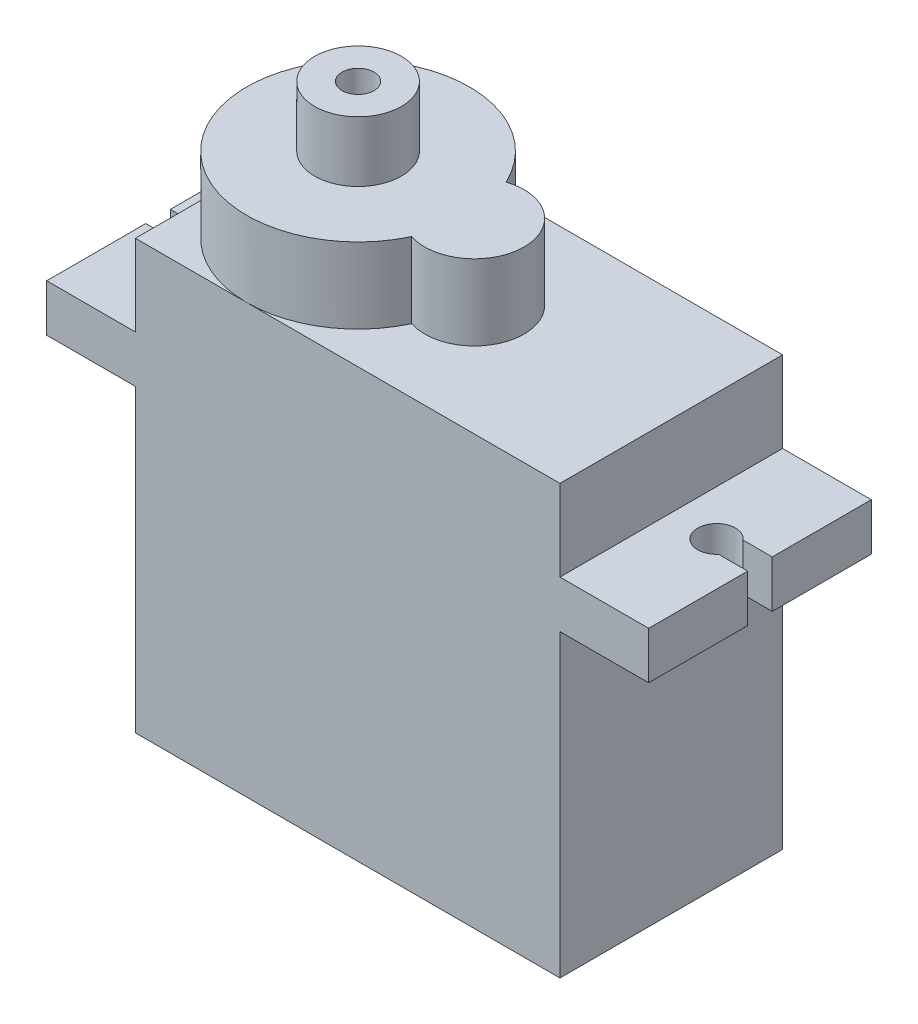
ISO-10303-21;
HEADER;
FILE_DESCRIPTION(('STEP AP214'),'2;1');
FILE_NAME('part.step','',(''),(''),'','','');
FILE_SCHEMA(('AUTOMOTIVE_DESIGN { 1 0 10303 214 1 1 1 1 }'));
ENDSEC;
DATA;
#1=APPLICATION_CONTEXT('core data for automotive mechanical design processes');
#2=APPLICATION_PROTOCOL_DEFINITION('international standard','automotive_design',2000,#1);
#3=PRODUCT_CONTEXT('',#1,'mechanical');
#4=PRODUCT('Part','Part','',(#3));
#5=PRODUCT_RELATED_PRODUCT_CATEGORY('part','',(#4));
#6=PRODUCT_DEFINITION_FORMATION('','',#4);
#7=PRODUCT_DEFINITION_CONTEXT('part definition',#1,'design');
#8=PRODUCT_DEFINITION('design','',#6,#7);
#9=PRODUCT_DEFINITION_SHAPE('','',#8);
#10=(LENGTH_UNIT() NAMED_UNIT(*) SI_UNIT(.MILLI.,.METRE.));
#11=(NAMED_UNIT(*) PLANE_ANGLE_UNIT() SI_UNIT($,.RADIAN.));
#12=(NAMED_UNIT(*) SI_UNIT($,.STERADIAN.) SOLID_ANGLE_UNIT());
#13=UNCERTAINTY_MEASURE_WITH_UNIT(LENGTH_MEASURE(1.E-05),#10,'distance_accuracy_value','');
#14=(GEOMETRIC_REPRESENTATION_CONTEXT(3) GLOBAL_UNCERTAINTY_ASSIGNED_CONTEXT((#13)) GLOBAL_UNIT_ASSIGNED_CONTEXT((#10,
#11,#12)) REPRESENTATION_CONTEXT('',''));
#15=CARTESIAN_POINT('',(0.,0.,0.));
#16=DIRECTION('',(0.,0.,1.));
#17=DIRECTION('',(1.,0.,0.));
#18=AXIS2_PLACEMENT_3D('',#15,#16,#17);
#19=CARTESIAN_POINT('',(27.2,15.9,-5.9));
#20=DIRECTION('',(0.,1.,0.));
#21=DIRECTION('',(0.,0.,1.));
#22=AXIS2_PLACEMENT_3D('',#19,#20,#21);
#23=PLANE('',#22);
#24=DIRECTION('',(1.,0.,0.));
#25=VECTOR('',#24,1.);
#26=CARTESIAN_POINT('',(27.2,15.9,-6.55));
#27=LINE('',#26,#25);
#28=CARTESIAN_POINT('',(25.6599342076785,15.9,-6.55));
#29=VERTEX_POINT('',#28);
#30=CARTESIAN_POINT('',(27.2,15.9,-6.55));
#31=VERTEX_POINT('',#30);
#32=EDGE_CURVE('E202',#29,#31,#27,.T.);
#33=ORIENTED_EDGE('',*,*,#32,.F.);
#34=CARTESIAN_POINT('',(24.9,15.9,-5.9));
#35=DIRECTION('',(0.,1.,0.));
#36=DIRECTION('',(0.,0.,1.));
#37=AXIS2_PLACEMENT_3D('',#34,#35,#36);
#38=CIRCLE('',#37,1.);
#39=CARTESIAN_POINT('',(25.6599342076785,15.9,-5.25));
#40=VERTEX_POINT('',#39);
#41=EDGE_CURVE('E401',#40,#29,#38,.F.);
#42=ORIENTED_EDGE('',*,*,#41,.F.);
#43=DIRECTION('',(-1.,0.,0.));
#44=VECTOR('',#43,1.);
#45=CARTESIAN_POINT('',(27.2,15.9,-5.25));
#46=LINE('',#45,#44);
#47=CARTESIAN_POINT('',(27.2,15.9,-5.25));
#48=VERTEX_POINT('',#47);
#49=EDGE_CURVE('E206',#48,#40,#46,.T.);
#50=ORIENTED_EDGE('',*,*,#49,.F.);
#51=DIRECTION('',(0.,0.,-1.));
#52=VECTOR('',#51,1.);
#53=CARTESIAN_POINT('',(27.2,15.9,0.));
#54=LINE('',#53,#52);
#55=CARTESIAN_POINT('',(27.2,15.9,0.));
#56=VERTEX_POINT('',#55);
#57=EDGE_CURVE('E350',#56,#48,#54,.T.);
#58=ORIENTED_EDGE('',*,*,#57,.F.);
#59=DIRECTION('',(-1.,0.,0.));
#60=VECTOR('',#59,1.);
#61=CARTESIAN_POINT('',(27.2,15.9,0.));
#62=LINE('',#61,#60);
#63=CARTESIAN_POINT('',(22.5,15.9,0.));
#64=VERTEX_POINT('',#63);
#65=EDGE_CURVE('E224',#56,#64,#62,.T.);
#66=ORIENTED_EDGE('',*,*,#65,.T.);
#67=DIRECTION('',(0.,0.,-1.));
#68=VECTOR('',#67,1.);
#69=CARTESIAN_POINT('',(22.5,15.9,-5.9));
#70=LINE('',#69,#68);
#71=CARTESIAN_POINT('',(22.5,15.9,-11.8));
#72=VERTEX_POINT('',#71);
#73=EDGE_CURVE('E229',#64,#72,#70,.T.);
#74=ORIENTED_EDGE('',*,*,#73,.T.);
#75=DIRECTION('',(-1.,0.,0.));
#76=VECTOR('',#75,1.);
#77=CARTESIAN_POINT('',(27.2,15.9,-11.8));
#78=LINE('',#77,#76);
#79=CARTESIAN_POINT('',(27.2,15.9,-11.8));
#80=VERTEX_POINT('',#79);
#81=EDGE_CURVE('E244',#80,#72,#78,.T.);
#82=ORIENTED_EDGE('',*,*,#81,.F.);
#83=EDGE_CURVE('E236',#31,#80,#54,.T.);
#84=ORIENTED_EDGE('',*,*,#83,.F.);
#85=EDGE_LOOP('',(#33,#42,#50,#58,#66,#74,#82,#84));
#86=FACE_BOUND('',#85,.T.);
#87=ADVANCED_FACE('F36',(#86),#23,.F.);
#88=CARTESIAN_POINT('',(27.2,18.4,-11.8));
#89=DIRECTION('',(0.,-1.,0.));
#90=DIRECTION('',(0.,0.,-1.));
#91=AXIS2_PLACEMENT_3D('',#88,#89,#90);
#92=PLANE('',#91);
#93=DIRECTION('',(1.,0.,0.));
#94=VECTOR('',#93,1.);
#95=CARTESIAN_POINT('',(27.2,18.4,-6.55));
#96=LINE('',#95,#94);
#97=CARTESIAN_POINT('',(25.6599342076785,18.4,-6.55));
#98=VERTEX_POINT('',#97);
#99=CARTESIAN_POINT('',(27.2,18.4,-6.55));
#100=VERTEX_POINT('',#99);
#101=EDGE_CURVE('E199',#98,#100,#96,.T.);
#102=ORIENTED_EDGE('',*,*,#101,.T.);
#103=DIRECTION('',(0.,0.,1.));
#104=VECTOR('',#103,1.);
#105=CARTESIAN_POINT('',(27.2,18.4,-11.8));
#106=LINE('',#105,#104);
#107=CARTESIAN_POINT('',(27.2,18.4,-11.8));
#108=VERTEX_POINT('',#107);
#109=EDGE_CURVE('E214',#108,#100,#106,.T.);
#110=ORIENTED_EDGE('',*,*,#109,.F.);
#111=DIRECTION('',(-1.,0.,0.));
#112=VECTOR('',#111,1.);
#113=CARTESIAN_POINT('',(27.2,18.4,-11.8));
#114=LINE('',#113,#112);
#115=CARTESIAN_POINT('',(22.5,18.4,-11.8));
#116=VERTEX_POINT('',#115);
#117=EDGE_CURVE('E242',#108,#116,#114,.T.);
#118=ORIENTED_EDGE('',*,*,#117,.T.);
#119=DIRECTION('',(0.,0.,1.));
#120=VECTOR('',#119,1.);
#121=CARTESIAN_POINT('',(22.5,18.4,-11.8));
#122=LINE('',#121,#120);
#123=CARTESIAN_POINT('',(22.5,18.4,0.));
#124=VERTEX_POINT('',#123);
#125=EDGE_CURVE('E232',#116,#124,#122,.T.);
#126=ORIENTED_EDGE('',*,*,#125,.T.);
#127=DIRECTION('',(-1.,0.,0.));
#128=VECTOR('',#127,1.);
#129=CARTESIAN_POINT('',(27.2,18.4,0.));
#130=LINE('',#129,#128);
#131=CARTESIAN_POINT('',(27.2,18.4,0.));
#132=VERTEX_POINT('',#131);
#133=EDGE_CURVE('E239',#132,#124,#130,.T.);
#134=ORIENTED_EDGE('',*,*,#133,.F.);
#135=CARTESIAN_POINT('',(27.2,18.4,-5.25));
#136=VERTEX_POINT('',#135);
#137=EDGE_CURVE('E222',#136,#132,#106,.T.);
#138=ORIENTED_EDGE('',*,*,#137,.F.);
#139=DIRECTION('',(-1.,0.,0.));
#140=VECTOR('',#139,1.);
#141=CARTESIAN_POINT('',(27.2,18.4,-5.25));
#142=LINE('',#141,#140);
#143=CARTESIAN_POINT('',(25.6599342076785,18.4,-5.25));
#144=VERTEX_POINT('',#143);
#145=EDGE_CURVE('E51',#136,#144,#142,.T.);
#146=ORIENTED_EDGE('',*,*,#145,.T.);
#147=CARTESIAN_POINT('',(24.9,18.4,-5.9));
#148=DIRECTION('',(0.,-1.,0.));
#149=DIRECTION('',(0.,0.,-1.));
#150=AXIS2_PLACEMENT_3D('',#147,#148,#149);
#151=CIRCLE('',#150,1.);
#152=EDGE_CURVE('E215',#144,#98,#151,.T.);
#153=ORIENTED_EDGE('',*,*,#152,.T.);
#154=EDGE_LOOP('',(#102,#110,#118,#126,#134,#138,#146,#153));
#155=FACE_BOUND('',#154,.T.);
#156=ADVANCED_FACE('F212',(#155),#92,.F.);
#157=CARTESIAN_POINT('',(27.2,0.,0.));
#158=DIRECTION('',(1.,0.,0.));
#159=DIRECTION('',(0.,0.,-1.));
#160=AXIS2_PLACEMENT_3D('',#157,#158,#159);
#161=PLANE('',#160);
#162=ORIENTED_EDGE('',*,*,#109,.T.);
#163=DIRECTION('',(0.,-1.,0.));
#164=VECTOR('',#163,1.);
#165=CARTESIAN_POINT('',(27.2,78.1330272576249,-6.55));
#166=LINE('',#165,#164);
#167=EDGE_CURVE('E195',#100,#31,#166,.T.);
#168=ORIENTED_EDGE('',*,*,#167,.T.);
#169=ORIENTED_EDGE('',*,*,#83,.T.);
#170=DIRECTION('',(0.,1.,0.));
#171=VECTOR('',#170,1.);
#172=CARTESIAN_POINT('',(27.2,15.9,-11.8));
#173=LINE('',#172,#171);
#174=EDGE_CURVE('E219',#80,#108,#173,.T.);
#175=ORIENTED_EDGE('',*,*,#174,.T.);
#176=EDGE_LOOP('',(#162,#168,#169,#175));
#177=FACE_BOUND('',#176,.T.);
#178=ADVANCED_FACE('F217',(#177),#161,.T.);
#179=ORIENTED_EDGE('',*,*,#57,.T.);
#180=DIRECTION('',(0.,-1.,0.));
#181=VECTOR('',#180,1.);
#182=CARTESIAN_POINT('',(27.2,78.1330272576249,-5.25));
#183=LINE('',#182,#181);
#184=EDGE_CURVE('E409',#136,#48,#183,.T.);
#185=ORIENTED_EDGE('',*,*,#184,.F.);
#186=ORIENTED_EDGE('',*,*,#137,.T.);
#187=DIRECTION('',(0.,-1.,0.));
#188=VECTOR('',#187,1.);
#189=CARTESIAN_POINT('',(27.2,18.4,0.));
#190=LINE('',#189,#188);
#191=EDGE_CURVE('E221',#132,#56,#190,.T.);
#192=ORIENTED_EDGE('',*,*,#191,.T.);
#193=EDGE_LOOP('',(#179,#185,#186,#192));
#194=FACE_BOUND('',#193,.T.);
#195=ADVANCED_FACE('F414',(#194),#161,.T.);
#196=CARTESIAN_POINT('',(-4.7,15.9,-11.8));
#197=DIRECTION('',(0.,1.,0.));
#198=DIRECTION('',(0.,0.,1.));
#199=AXIS2_PLACEMENT_3D('',#196,#197,#198);
#200=PLANE('',#199);
#201=DIRECTION('',(-1.,0.,0.));
#202=VECTOR('',#201,1.);
#203=CARTESIAN_POINT('',(-4.7,15.9,-5.25));
#204=LINE('',#203,#202);
#205=CARTESIAN_POINT('',(-3.15993420767853,15.9,-5.25));
#206=VERTEX_POINT('',#205);
#207=CARTESIAN_POINT('',(-4.7,15.9,-5.25));
#208=VERTEX_POINT('',#207);
#209=EDGE_CURVE('E379',#206,#208,#204,.T.);
#210=ORIENTED_EDGE('',*,*,#209,.F.);
#211=CARTESIAN_POINT('',(-2.4,15.9,-5.9));
#212=DIRECTION('',(0.,1.,0.));
#213=DIRECTION('',(0.,0.,1.));
#214=AXIS2_PLACEMENT_3D('',#211,#212,#213);
#215=CIRCLE('',#214,1.);
#216=CARTESIAN_POINT('',(-3.15993420767853,15.9,-6.55));
#217=VERTEX_POINT('',#216);
#218=EDGE_CURVE('E375',#217,#206,#215,.F.);
#219=ORIENTED_EDGE('',*,*,#218,.F.);
#220=DIRECTION('',(1.,0.,0.));
#221=VECTOR('',#220,1.);
#222=CARTESIAN_POINT('',(-4.7,15.9,-6.55));
#223=LINE('',#222,#221);
#224=CARTESIAN_POINT('',(-4.7,15.9,-6.55));
#225=VERTEX_POINT('',#224);
#226=EDGE_CURVE('E381',#225,#217,#223,.T.);
#227=ORIENTED_EDGE('',*,*,#226,.F.);
#228=DIRECTION('',(0.,0.,1.));
#229=VECTOR('',#228,1.);
#230=CARTESIAN_POINT('',(-4.7,15.9,-11.8));
#231=LINE('',#230,#229);
#232=CARTESIAN_POINT('',(-4.7,15.9,-11.8));
#233=VERTEX_POINT('',#232);
#234=EDGE_CURVE('E253',#233,#225,#231,.T.);
#235=ORIENTED_EDGE('',*,*,#234,.F.);
#236=DIRECTION('',(1.,0.,0.));
#237=VECTOR('',#236,1.);
#238=CARTESIAN_POINT('',(-4.7,15.9,-11.8));
#239=LINE('',#238,#237);
#240=CARTESIAN_POINT('',(0.,15.9,-11.8));
#241=VERTEX_POINT('',#240);
#242=EDGE_CURVE('E275',#233,#241,#239,.T.);
#243=ORIENTED_EDGE('',*,*,#242,.T.);
#244=DIRECTION('',(0.,0.,1.));
#245=VECTOR('',#244,1.);
#246=CARTESIAN_POINT('',(0.,15.9,-11.8));
#247=LINE('',#246,#245);
#248=CARTESIAN_POINT('',(0.,15.9,0.));
#249=VERTEX_POINT('',#248);
#250=EDGE_CURVE('E247',#241,#249,#247,.T.);
#251=ORIENTED_EDGE('',*,*,#250,.T.);
#252=DIRECTION('',(1.,0.,0.));
#253=VECTOR('',#252,1.);
#254=CARTESIAN_POINT('',(-4.7,15.9,0.));
#255=LINE('',#254,#253);
#256=CARTESIAN_POINT('',(-4.7,15.9,0.));
#257=VERTEX_POINT('',#256);
#258=EDGE_CURVE('E272',#257,#249,#255,.T.);
#259=ORIENTED_EDGE('',*,*,#258,.F.);
#260=EDGE_CURVE('E251',#208,#257,#231,.T.);
#261=ORIENTED_EDGE('',*,*,#260,.F.);
#262=EDGE_LOOP('',(#210,#219,#227,#235,#243,#251,#259,#261));
#263=FACE_BOUND('',#262,.T.);
#264=ADVANCED_FACE('F475',(#263),#200,.F.);
#265=CARTESIAN_POINT('',(-4.7,18.4,0.));
#266=DIRECTION('',(0.,-1.,0.));
#267=DIRECTION('',(0.,0.,-1.));
#268=AXIS2_PLACEMENT_3D('',#265,#266,#267);
#269=PLANE('',#268);
#270=DIRECTION('',(-1.,0.,0.));
#271=VECTOR('',#270,1.);
#272=CARTESIAN_POINT('',(-4.7,18.4,-5.25));
#273=LINE('',#272,#271);
#274=CARTESIAN_POINT('',(-3.15993420767853,18.4,-5.25));
#275=VERTEX_POINT('',#274);
#276=CARTESIAN_POINT('',(-4.7,18.4,-5.25));
#277=VERTEX_POINT('',#276);
#278=EDGE_CURVE('E398',#275,#277,#273,.T.);
#279=ORIENTED_EDGE('',*,*,#278,.T.);
#280=DIRECTION('',(0.,0.,-1.));
#281=VECTOR('',#280,1.);
#282=CARTESIAN_POINT('',(-4.7,18.4,0.));
#283=LINE('',#282,#281);
#284=CARTESIAN_POINT('',(-4.7,18.4,0.));
#285=VERTEX_POINT('',#284);
#286=EDGE_CURVE('E259',#285,#277,#283,.T.);
#287=ORIENTED_EDGE('',*,*,#286,.F.);
#288=DIRECTION('',(1.,0.,0.));
#289=VECTOR('',#288,1.);
#290=CARTESIAN_POINT('',(-4.7,18.4,0.));
#291=LINE('',#290,#289);
#292=CARTESIAN_POINT('',(0.,18.4,0.));
#293=VERTEX_POINT('',#292);
#294=EDGE_CURVE('E269',#285,#293,#291,.T.);
#295=ORIENTED_EDGE('',*,*,#294,.T.);
#296=DIRECTION('',(0.,0.,-1.));
#297=VECTOR('',#296,1.);
#298=CARTESIAN_POINT('',(0.,18.4,0.));
#299=LINE('',#298,#297);
#300=CARTESIAN_POINT('',(0.,18.4,-11.8));
#301=VERTEX_POINT('',#300);
#302=EDGE_CURVE('E252',#293,#301,#299,.T.);
#303=ORIENTED_EDGE('',*,*,#302,.T.);
#304=DIRECTION('',(1.,0.,0.));
#305=VECTOR('',#304,1.);
#306=CARTESIAN_POINT('',(-4.7,18.4,-11.8));
#307=LINE('',#306,#305);
#308=CARTESIAN_POINT('',(-4.7,18.4,-11.8));
#309=VERTEX_POINT('',#308);
#310=EDGE_CURVE('E262',#309,#301,#307,.T.);
#311=ORIENTED_EDGE('',*,*,#310,.F.);
#312=CARTESIAN_POINT('',(-4.7,18.4,-6.55));
#313=VERTEX_POINT('',#312);
#314=EDGE_CURVE('E258',#313,#309,#283,.T.);
#315=ORIENTED_EDGE('',*,*,#314,.F.);
#316=DIRECTION('',(1.,0.,0.));
#317=VECTOR('',#316,1.);
#318=CARTESIAN_POINT('',(-4.7,18.4,-6.55));
#319=LINE('',#318,#317);
#320=CARTESIAN_POINT('',(-3.15993420767853,18.4,-6.55));
#321=VERTEX_POINT('',#320);
#322=EDGE_CURVE('E59',#313,#321,#319,.T.);
#323=ORIENTED_EDGE('',*,*,#322,.T.);
#324=CARTESIAN_POINT('',(-2.4,18.4,-5.9));
#325=DIRECTION('',(0.,-1.,0.));
#326=DIRECTION('',(0.,0.,-1.));
#327=AXIS2_PLACEMENT_3D('',#324,#325,#326);
#328=CIRCLE('',#327,1.);
#329=EDGE_CURVE('E395',#321,#275,#328,.T.);
#330=ORIENTED_EDGE('',*,*,#329,.T.);
#331=EDGE_LOOP('',(#279,#287,#295,#303,#311,#315,#323,#330));
#332=FACE_BOUND('',#331,.T.);
#333=ADVANCED_FACE('F472',(#332),#269,.F.);
#334=CARTESIAN_POINT('',(-4.7,0.,0.));
#335=DIRECTION('',(-1.,0.,0.));
#336=DIRECTION('',(0.,0.,1.));
#337=AXIS2_PLACEMENT_3D('',#334,#335,#336);
#338=PLANE('',#337);
#339=ORIENTED_EDGE('',*,*,#286,.T.);
#340=DIRECTION('',(0.,-1.,0.));
#341=VECTOR('',#340,1.);
#342=CARTESIAN_POINT('',(-4.7,80.3830272576249,-5.25));
#343=LINE('',#342,#341);
#344=EDGE_CURVE('E383',#277,#208,#343,.T.);
#345=ORIENTED_EDGE('',*,*,#344,.T.);
#346=ORIENTED_EDGE('',*,*,#260,.T.);
#347=DIRECTION('',(0.,1.,0.));
#348=VECTOR('',#347,1.);
#349=CARTESIAN_POINT('',(-4.7,15.9,0.));
#350=LINE('',#349,#348);
#351=EDGE_CURVE('E256',#257,#285,#350,.T.);
#352=ORIENTED_EDGE('',*,*,#351,.T.);
#353=EDGE_LOOP('',(#339,#345,#346,#352));
#354=FACE_BOUND('',#353,.T.);
#355=ADVANCED_FACE('F469',(#354),#338,.T.);
#356=ORIENTED_EDGE('',*,*,#234,.T.);
#357=DIRECTION('',(0.,-1.,0.));
#358=VECTOR('',#357,1.);
#359=CARTESIAN_POINT('',(-4.7,80.3830272576249,-6.55));
#360=LINE('',#359,#358);
#361=EDGE_CURVE('E392',#313,#225,#360,.T.);
#362=ORIENTED_EDGE('',*,*,#361,.F.);
#363=ORIENTED_EDGE('',*,*,#314,.T.);
#364=DIRECTION('',(0.,-1.,0.));
#365=VECTOR('',#364,1.);
#366=CARTESIAN_POINT('',(-4.7,18.4,-11.8));
#367=LINE('',#366,#365);
#368=EDGE_CURVE('E248',#309,#233,#367,.T.);
#369=ORIENTED_EDGE('',*,*,#368,.T.);
#370=EDGE_LOOP('',(#356,#362,#363,#369));
#371=FACE_BOUND('',#370,.T.);
#372=ADVANCED_FACE('F459',(#371),#338,.T.);
#373=CARTESIAN_POINT('',(0.,22.7,0.));
#374=DIRECTION('',(0.,1.,0.));
#375=DIRECTION('',(0.,0.,1.));
#376=AXIS2_PLACEMENT_3D('',#373,#374,#375);
#377=PLANE('',#376);
#378=CARTESIAN_POINT('',(12.0678125706763,22.7,-5.9));
#379=DIRECTION('',(0.,1.,0.));
#380=DIRECTION('',(0.,0.,-1.));
#381=AXIS2_PLACEMENT_3D('',#378,#379,#380);
#382=CIRCLE('',#381,2.63218742932373);
#383=CARTESIAN_POINT('',(11.244155686355,22.7,-3.4));
#384=VERTEX_POINT('',#383);
#385=CARTESIAN_POINT('',(11.244155686355,22.7,-8.4));
#386=VERTEX_POINT('',#385);
#387=EDGE_CURVE('E362',#384,#386,#382,.T.);
#388=ORIENTED_EDGE('',*,*,#387,.F.);
#389=CARTESIAN_POINT('',(5.9,22.7,-5.9));
#390=DIRECTION('',(0.,1.,0.));
#391=DIRECTION('',(0.,0.,1.));
#392=AXIS2_PLACEMENT_3D('',#389,#390,#391);
#393=CIRCLE('',#392,5.9);
#394=CARTESIAN_POINT('',(5.9,22.7,0.));
#395=VERTEX_POINT('',#394);
#396=EDGE_CURVE('E316',#395,#384,#393,.T.);
#397=ORIENTED_EDGE('',*,*,#396,.F.);
#398=DIRECTION('',(1.,0.,0.));
#399=VECTOR('',#398,1.);
#400=CARTESIAN_POINT('',(0.,22.7,0.));
#401=LINE('',#400,#399);
#402=CARTESIAN_POINT('',(22.5,22.7,0.));
#403=VERTEX_POINT('',#402);
#404=EDGE_CURVE('E282',#395,#403,#401,.T.);
#405=ORIENTED_EDGE('',*,*,#404,.T.);
#406=DIRECTION('',(0.,0.,-1.));
#407=VECTOR('',#406,1.);
#408=CARTESIAN_POINT('',(22.5,22.7,0.));
#409=LINE('',#408,#407);
#410=CARTESIAN_POINT('',(22.5,22.7,-11.8));
#411=VERTEX_POINT('',#410);
#412=EDGE_CURVE('E287',#403,#411,#409,.T.);
#413=ORIENTED_EDGE('',*,*,#412,.T.);
#414=DIRECTION('',(-1.,0.,0.));
#415=VECTOR('',#414,1.);
#416=CARTESIAN_POINT('',(22.5,22.7,-11.8));
#417=LINE('',#416,#415);
#418=CARTESIAN_POINT('',(5.9,22.7,-11.8));
#419=VERTEX_POINT('',#418);
#420=EDGE_CURVE('E290',#411,#419,#417,.T.);
#421=ORIENTED_EDGE('',*,*,#420,.T.);
#422=EDGE_CURVE('E324',#386,#419,#393,.T.);
#423=ORIENTED_EDGE('',*,*,#422,.F.);
#424=EDGE_LOOP('',(#388,#397,#405,#413,#421,#423));
#425=FACE_BOUND('',#424,.T.);
#426=ADVANCED_FACE('F426',(#425),#377,.T.);
#427=CARTESIAN_POINT('',(0.,22.7,-5.9));
#428=VERTEX_POINT('',#427);
#429=EDGE_CURVE('E44',#419,#428,#393,.T.);
#430=ORIENTED_EDGE('',*,*,#429,.F.);
#431=CARTESIAN_POINT('',(0.,22.7,-11.8));
#432=VERTEX_POINT('',#431);
#433=EDGE_CURVE('E289',#419,#432,#417,.T.);
#434=ORIENTED_EDGE('',*,*,#433,.T.);
#435=DIRECTION('',(0.,0.,1.));
#436=VECTOR('',#435,1.);
#437=CARTESIAN_POINT('',(0.,22.7,-11.8));
#438=LINE('',#437,#436);
#439=EDGE_CURVE('E279',#432,#428,#438,.T.);
#440=ORIENTED_EDGE('',*,*,#439,.T.);
#441=EDGE_LOOP('',(#430,#434,#440));
#442=FACE_BOUND('',#441,.T.);
#443=ADVANCED_FACE('F440',(#442),#377,.T.);
#444=CARTESIAN_POINT('',(22.5,22.7,0.));
#445=DIRECTION('',(-1.,0.,0.));
#446=DIRECTION('',(0.,0.,1.));
#447=AXIS2_PLACEMENT_3D('',#444,#445,#446);
#448=PLANE('',#447);
#449=ORIENTED_EDGE('',*,*,#73,.F.);
#450=DIRECTION('',(0.,-1.,0.));
#451=VECTOR('',#450,1.);
#452=CARTESIAN_POINT('',(22.5,22.7,0.));
#453=LINE('',#452,#451);
#454=CARTESIAN_POINT('',(22.5,0.,0.));
#455=VERTEX_POINT('',#454);
#456=EDGE_CURVE('E311',#64,#455,#453,.T.);
#457=ORIENTED_EDGE('',*,*,#456,.T.);
#458=DIRECTION('',(0.,0.,-1.));
#459=VECTOR('',#458,1.);
#460=CARTESIAN_POINT('',(22.5,0.,0.));
#461=LINE('',#460,#459);
#462=CARTESIAN_POINT('',(22.5,0.,-11.8));
#463=VERTEX_POINT('',#462);
#464=EDGE_CURVE('E299',#455,#463,#461,.T.);
#465=ORIENTED_EDGE('',*,*,#464,.T.);
#466=DIRECTION('',(0.,-1.,0.));
#467=VECTOR('',#466,1.);
#468=CARTESIAN_POINT('',(22.5,22.7,-11.8));
#469=LINE('',#468,#467);
#470=EDGE_CURVE('E307',#72,#463,#469,.T.);
#471=ORIENTED_EDGE('',*,*,#470,.F.);
#472=EDGE_LOOP('',(#449,#457,#465,#471));
#473=FACE_BOUND('',#472,.T.);
#474=ADVANCED_FACE('F343',(#473),#448,.F.);
#475=ORIENTED_EDGE('',*,*,#125,.F.);
#476=EDGE_CURVE('E308',#411,#116,#469,.T.);
#477=ORIENTED_EDGE('',*,*,#476,.F.);
#478=ORIENTED_EDGE('',*,*,#412,.F.);
#479=EDGE_CURVE('E312',#403,#124,#453,.T.);
#480=ORIENTED_EDGE('',*,*,#479,.T.);
#481=EDGE_LOOP('',(#475,#477,#478,#480));
#482=FACE_BOUND('',#481,.T.);
#483=ADVANCED_FACE('F424',(#482),#448,.F.);
#484=CARTESIAN_POINT('',(0.,22.7,-11.8));
#485=DIRECTION('',(1.,0.,0.));
#486=DIRECTION('',(0.,0.,-1.));
#487=AXIS2_PLACEMENT_3D('',#484,#485,#486);
#488=PLANE('',#487);
#489=ORIENTED_EDGE('',*,*,#302,.F.);
#490=DIRECTION('',(0.,-1.,0.));
#491=VECTOR('',#490,1.);
#492=CARTESIAN_POINT('',(0.,22.7,0.));
#493=LINE('',#492,#491);
#494=CARTESIAN_POINT('',(0.,22.7,0.));
#495=VERTEX_POINT('',#494);
#496=EDGE_CURVE('E314',#495,#293,#493,.T.);
#497=ORIENTED_EDGE('',*,*,#496,.F.);
#498=EDGE_CURVE('E283',#428,#495,#438,.T.);
#499=ORIENTED_EDGE('',*,*,#498,.F.);
#500=ORIENTED_EDGE('',*,*,#439,.F.);
#501=DIRECTION('',(0.,-1.,0.));
#502=VECTOR('',#501,1.);
#503=CARTESIAN_POINT('',(0.,22.7,-11.8));
#504=LINE('',#503,#502);
#505=EDGE_CURVE('E305',#432,#301,#504,.T.);
#506=ORIENTED_EDGE('',*,*,#505,.T.);
#507=EDGE_LOOP('',(#489,#497,#499,#500,#506));
#508=FACE_BOUND('',#507,.T.);
#509=ADVANCED_FACE('F38',(#508),#488,.F.);
#510=ORIENTED_EDGE('',*,*,#250,.F.);
#511=CARTESIAN_POINT('',(0.,0.,-11.8));
#512=VERTEX_POINT('',#511);
#513=EDGE_CURVE('E293',#241,#512,#504,.T.);
#514=ORIENTED_EDGE('',*,*,#513,.T.);
#515=DIRECTION('',(0.,0.,1.));
#516=VECTOR('',#515,1.);
#517=CARTESIAN_POINT('',(0.,0.,-11.8));
#518=LINE('',#517,#516);
#519=CARTESIAN_POINT('',(0.,0.,0.));
#520=VERTEX_POINT('',#519);
#521=EDGE_CURVE('E278',#512,#520,#518,.T.);
#522=ORIENTED_EDGE('',*,*,#521,.T.);
#523=EDGE_CURVE('E313',#249,#520,#493,.T.);
#524=ORIENTED_EDGE('',*,*,#523,.F.);
#525=EDGE_LOOP('',(#510,#514,#522,#524));
#526=FACE_BOUND('',#525,.T.);
#527=ADVANCED_FACE('F336',(#526),#488,.F.);
#528=CARTESIAN_POINT('',(0.,22.7,0.));
#529=DIRECTION('',(0.,0.,-1.));
#530=DIRECTION('',(-1.,0.,0.));
#531=AXIS2_PLACEMENT_3D('',#528,#529,#530);
#532=PLANE('',#531);
#533=DIRECTION('',(1.,0.,0.));
#534=VECTOR('',#533,1.);
#535=CARTESIAN_POINT('',(0.,0.,0.));
#536=LINE('',#535,#534);
#537=EDGE_CURVE('E296',#520,#455,#536,.T.);
#538=ORIENTED_EDGE('',*,*,#537,.T.);
#539=ORIENTED_EDGE('',*,*,#456,.F.);
#540=ORIENTED_EDGE('',*,*,#65,.F.);
#541=ORIENTED_EDGE('',*,*,#191,.F.);
#542=ORIENTED_EDGE('',*,*,#133,.T.);
#543=ORIENTED_EDGE('',*,*,#479,.F.);
#544=ORIENTED_EDGE('',*,*,#404,.F.);
#545=EDGE_CURVE('E284',#495,#395,#401,.T.);
#546=ORIENTED_EDGE('',*,*,#545,.F.);
#547=ORIENTED_EDGE('',*,*,#496,.T.);
#548=ORIENTED_EDGE('',*,*,#294,.F.);
#549=ORIENTED_EDGE('',*,*,#351,.F.);
#550=ORIENTED_EDGE('',*,*,#258,.T.);
#551=ORIENTED_EDGE('',*,*,#523,.T.);
#552=EDGE_LOOP('',(#538,#539,#540,#541,#542,#543,#544,#546,#547,#548,#549,#550,#551));
#553=FACE_BOUND('',#552,.T.);
#554=ADVANCED_FACE('F326',(#553),#532,.F.);
#555=CARTESIAN_POINT('',(22.5,22.7,-11.8));
#556=DIRECTION('',(0.,0.,1.));
#557=DIRECTION('',(1.,0.,0.));
#558=AXIS2_PLACEMENT_3D('',#555,#556,#557);
#559=PLANE('',#558);
#560=DIRECTION('',(-1.,0.,0.));
#561=VECTOR('',#560,1.);
#562=CARTESIAN_POINT('',(22.5,0.,-11.8));
#563=LINE('',#562,#561);
#564=EDGE_CURVE('E302',#463,#512,#563,.T.);
#565=ORIENTED_EDGE('',*,*,#564,.T.);
#566=ORIENTED_EDGE('',*,*,#513,.F.);
#567=ORIENTED_EDGE('',*,*,#242,.F.);
#568=ORIENTED_EDGE('',*,*,#368,.F.);
#569=ORIENTED_EDGE('',*,*,#310,.T.);
#570=ORIENTED_EDGE('',*,*,#505,.F.);
#571=ORIENTED_EDGE('',*,*,#433,.F.);
#572=ORIENTED_EDGE('',*,*,#420,.F.);
#573=ORIENTED_EDGE('',*,*,#476,.T.);
#574=ORIENTED_EDGE('',*,*,#117,.F.);
#575=ORIENTED_EDGE('',*,*,#174,.F.);
#576=ORIENTED_EDGE('',*,*,#81,.T.);
#577=ORIENTED_EDGE('',*,*,#470,.T.);
#578=EDGE_LOOP('',(#565,#566,#567,#568,#569,#570,#571,#572,#573,#574,#575,#576,#577));
#579=FACE_BOUND('',#578,.T.);
#580=ADVANCED_FACE('F340',(#579),#559,.F.);
#581=EDGE_CURVE('E322',#428,#395,#393,.T.);
#582=ORIENTED_EDGE('',*,*,#581,.F.);
#583=ORIENTED_EDGE('',*,*,#498,.T.);
#584=ORIENTED_EDGE('',*,*,#545,.T.);
#585=EDGE_LOOP('',(#582,#583,#584));
#586=FACE_BOUND('',#585,.T.);
#587=ADVANCED_FACE('F448',(#586),#377,.T.);
#588=CARTESIAN_POINT('',(0.,0.,0.));
#589=DIRECTION('',(0.,1.,0.));
#590=DIRECTION('',(0.,0.,1.));
#591=AXIS2_PLACEMENT_3D('',#588,#589,#590);
#592=PLANE('',#591);
#593=ORIENTED_EDGE('',*,*,#521,.F.);
#594=ORIENTED_EDGE('',*,*,#564,.F.);
#595=ORIENTED_EDGE('',*,*,#464,.F.);
#596=ORIENTED_EDGE('',*,*,#537,.F.);
#597=EDGE_LOOP('',(#593,#594,#595,#596));
#598=FACE_BOUND('',#597,.T.);
#599=ADVANCED_FACE('F334',(#598),#592,.F.);
#600=CARTESIAN_POINT('',(12.0678125706763,26.7,-5.9));
#601=DIRECTION('',(0.,-1.,0.));
#602=DIRECTION('',(0.,0.,-1.));
#603=AXIS2_PLACEMENT_3D('',#600,#601,#602);
#604=CYLINDRICAL_SURFACE('',#603,2.63218742932373);
#605=ORIENTED_EDGE('',*,*,#387,.T.);
#606=DIRECTION('',(0.,-1.,0.));
#607=VECTOR('',#606,1.);
#608=CARTESIAN_POINT('',(11.244155686355,26.7,-8.4));
#609=LINE('',#608,#607);
#610=CARTESIAN_POINT('',(11.244155686355,26.7,-8.4));
#611=VERTEX_POINT('',#610);
#612=EDGE_CURVE('E233',#611,#386,#609,.T.);
#613=ORIENTED_EDGE('',*,*,#612,.F.);
#614=CARTESIAN_POINT('',(12.0678125706763,26.7,-5.9));
#615=DIRECTION('',(0.,1.,0.));
#616=DIRECTION('',(0.,0.,-1.));
#617=AXIS2_PLACEMENT_3D('',#614,#615,#616);
#618=CIRCLE('',#617,2.63218742932373);
#619=CARTESIAN_POINT('',(11.244155686355,26.7,-3.4));
#620=VERTEX_POINT('',#619);
#621=EDGE_CURVE('E361',#620,#611,#618,.T.);
#622=ORIENTED_EDGE('',*,*,#621,.F.);
#623=DIRECTION('',(0.,-1.,0.));
#624=VECTOR('',#623,1.);
#625=CARTESIAN_POINT('',(11.244155686355,26.7,-3.4));
#626=LINE('',#625,#624);
#627=EDGE_CURVE('E356',#620,#384,#626,.T.);
#628=ORIENTED_EDGE('',*,*,#627,.T.);
#629=EDGE_LOOP('',(#605,#613,#622,#628));
#630=FACE_BOUND('',#629,.T.);
#631=ADVANCED_FACE('F434',(#630),#604,.T.);
#632=CARTESIAN_POINT('',(5.9,26.7,-5.9));
#633=DIRECTION('',(0.,-1.,0.));
#634=DIRECTION('',(0.,0.,-1.));
#635=AXIS2_PLACEMENT_3D('',#632,#633,#634);
#636=CYLINDRICAL_SURFACE('',#635,5.9);
#637=ORIENTED_EDGE('',*,*,#422,.T.);
#638=ORIENTED_EDGE('',*,*,#429,.T.);
#639=ORIENTED_EDGE('',*,*,#581,.T.);
#640=ORIENTED_EDGE('',*,*,#396,.T.);
#641=ORIENTED_EDGE('',*,*,#627,.F.);
#642=CARTESIAN_POINT('',(5.9,26.7,-5.9));
#643=DIRECTION('',(0.,1.,0.));
#644=DIRECTION('',(0.,0.,1.));
#645=AXIS2_PLACEMENT_3D('',#642,#643,#644);
#646=CIRCLE('',#645,5.9);
#647=EDGE_CURVE('E358',#611,#620,#646,.T.);
#648=ORIENTED_EDGE('',*,*,#647,.F.);
#649=ORIENTED_EDGE('',*,*,#612,.T.);
#650=EDGE_LOOP('',(#637,#638,#639,#640,#641,#648,#649));
#651=FACE_BOUND('',#650,.T.);
#652=ADVANCED_FACE('F430',(#651),#636,.T.);
#653=CARTESIAN_POINT('',(8.98390628533813,26.7,-5.9));
#654=DIRECTION('',(0.,-1.,0.));
#655=DIRECTION('',(0.,0.,-1.));
#656=AXIS2_PLACEMENT_3D('',#653,#654,#655);
#657=PLANE('',#656);
#658=CARTESIAN_POINT('',(5.9,26.7,-5.9));
#659=DIRECTION('',(0.,-1.,0.));
#660=DIRECTION('',(0.,0.,-1.));
#661=AXIS2_PLACEMENT_3D('',#658,#659,#660);
#662=CIRCLE('',#661,2.3);
#663=CARTESIAN_POINT('',(5.9,26.7,-8.2));
#664=VERTEX_POINT('',#663);
#665=EDGE_CURVE('E11',#664,#664,#662,.F.);
#666=ORIENTED_EDGE('',*,*,#665,.F.);
#667=EDGE_LOOP('',(#666));
#668=FACE_BOUND('',#667,.T.);
#669=ORIENTED_EDGE('',*,*,#621,.T.);
#670=ORIENTED_EDGE('',*,*,#647,.T.);
#671=EDGE_LOOP('',(#669,#670));
#672=FACE_BOUND('',#671,.T.);
#673=ADVANCED_FACE('F437',(#668,#672),#657,.F.);
#674=CARTESIAN_POINT('',(5.9,29.9,-5.9));
#675=DIRECTION('',(0.,1.,0.));
#676=DIRECTION('',(0.,0.,1.));
#677=AXIS2_PLACEMENT_3D('',#674,#675,#676);
#678=PLANE('',#677);
#679=CARTESIAN_POINT('',(5.9,29.9,-5.9));
#680=DIRECTION('',(0.,1.,0.));
#681=DIRECTION('',(0.,0.,1.));
#682=AXIS2_PLACEMENT_3D('',#679,#680,#681);
#683=CIRCLE('',#682,2.3);
#684=CARTESIAN_POINT('',(5.9,29.9,-3.6));
#685=VERTEX_POINT('',#684);
#686=EDGE_CURVE('E365',#685,#685,#683,.T.);
#687=ORIENTED_EDGE('',*,*,#686,.T.);
#688=EDGE_LOOP('',(#687));
#689=FACE_BOUND('',#688,.T.);
#690=CARTESIAN_POINT('',(5.9,29.9,-5.9));
#691=DIRECTION('',(0.,1.,0.));
#692=DIRECTION('',(0.,0.,1.));
#693=AXIS2_PLACEMENT_3D('',#690,#691,#692);
#694=CIRCLE('',#693,0.85);
#695=CARTESIAN_POINT('',(5.9,29.9,-5.05));
#696=VERTEX_POINT('',#695);
#697=EDGE_CURVE('E371',#696,#696,#694,.T.);
#698=ORIENTED_EDGE('',*,*,#697,.F.);
#699=EDGE_LOOP('',(#698));
#700=FACE_BOUND('',#699,.T.);
#701=ADVANCED_FACE('F572',(#689,#700),#678,.T.);
#702=CARTESIAN_POINT('',(5.9,29.9,-5.9));
#703=DIRECTION('',(0.,-1.,0.));
#704=DIRECTION('',(0.,0.,-1.));
#705=AXIS2_PLACEMENT_3D('',#702,#703,#704);
#706=CYLINDRICAL_SURFACE('',#705,2.3);
#707=ORIENTED_EDGE('',*,*,#686,.F.);
#708=EDGE_LOOP('',(#707));
#709=FACE_BOUND('',#708,.T.);
#710=ORIENTED_EDGE('',*,*,#665,.T.);
#711=EDGE_LOOP('',(#710));
#712=FACE_BOUND('',#711,.T.);
#713=ADVANCED_FACE('F584',(#709,#712),#706,.T.);
#714=CARTESIAN_POINT('',(5.9,29.9,-5.9));
#715=DIRECTION('',(0.,-1.,0.));
#716=DIRECTION('',(0.,0.,-1.));
#717=AXIS2_PLACEMENT_3D('',#714,#715,#716);
#718=CYLINDRICAL_SURFACE('',#717,0.85);
#719=ORIENTED_EDGE('',*,*,#697,.T.);
#720=EDGE_LOOP('',(#719));
#721=FACE_BOUND('',#720,.T.);
#722=CARTESIAN_POINT('',(5.9,26.7,-5.9));
#723=DIRECTION('',(0.,1.,0.));
#724=DIRECTION('',(0.,0.,1.));
#725=AXIS2_PLACEMENT_3D('',#722,#723,#724);
#726=CIRCLE('',#725,0.85);
#727=CARTESIAN_POINT('',(5.9,26.7,-5.05));
#728=VERTEX_POINT('',#727);
#729=EDGE_CURVE('E372',#728,#728,#726,.T.);
#730=ORIENTED_EDGE('',*,*,#729,.F.);
#731=EDGE_LOOP('',(#730));
#732=FACE_BOUND('',#731,.T.);
#733=ADVANCED_FACE('F594',(#721,#732),#718,.F.);
#734=ORIENTED_EDGE('',*,*,#729,.T.);
#735=EDGE_LOOP('',(#734));
#736=FACE_BOUND('',#735,.T.);
#737=ADVANCED_FACE('F575',(#736),#657,.F.);
#738=CARTESIAN_POINT('',(-2.4,80.3830272576249,-5.9));
#739=DIRECTION('',(0.,-1.,0.));
#740=DIRECTION('',(0.,0.,-1.));
#741=AXIS2_PLACEMENT_3D('',#738,#739,#740);
#742=CYLINDRICAL_SURFACE('',#741,1.);
#743=DIRECTION('',(0.,-1.,0.));
#744=VECTOR('',#743,1.);
#745=CARTESIAN_POINT('',(-3.15993420767853,80.3830272576249,-6.55));
#746=LINE('',#745,#744);
#747=EDGE_CURVE('E389',#321,#217,#746,.T.);
#748=ORIENTED_EDGE('',*,*,#747,.T.);
#749=ORIENTED_EDGE('',*,*,#218,.T.);
#750=DIRECTION('',(0.,-1.,0.));
#751=VECTOR('',#750,1.);
#752=CARTESIAN_POINT('',(-3.15993420767853,80.3830272576249,-5.25));
#753=LINE('',#752,#751);
#754=EDGE_CURVE('E386',#275,#206,#753,.T.);
#755=ORIENTED_EDGE('',*,*,#754,.F.);
#756=ORIENTED_EDGE('',*,*,#329,.F.);
#757=EDGE_LOOP('',(#748,#749,#755,#756));
#758=FACE_BOUND('',#757,.T.);
#759=ADVANCED_FACE('F491',(#758),#742,.F.);
#760=CARTESIAN_POINT('',(-4.7,80.3830272576249,-5.25));
#761=DIRECTION('',(0.,0.,-1.));
#762=DIRECTION('',(-1.,0.,0.));
#763=AXIS2_PLACEMENT_3D('',#760,#761,#762);
#764=PLANE('',#763);
#765=ORIENTED_EDGE('',*,*,#754,.T.);
#766=ORIENTED_EDGE('',*,*,#209,.T.);
#767=ORIENTED_EDGE('',*,*,#344,.F.);
#768=ORIENTED_EDGE('',*,*,#278,.F.);
#769=EDGE_LOOP('',(#765,#766,#767,#768));
#770=FACE_BOUND('',#769,.T.);
#771=ADVANCED_FACE('F487',(#770),#764,.T.);
#772=CARTESIAN_POINT('',(-4.7,80.3830272576249,-6.55));
#773=DIRECTION('',(0.,0.,1.));
#774=DIRECTION('',(1.,0.,0.));
#775=AXIS2_PLACEMENT_3D('',#772,#773,#774);
#776=PLANE('',#775);
#777=ORIENTED_EDGE('',*,*,#361,.T.);
#778=ORIENTED_EDGE('',*,*,#226,.T.);
#779=ORIENTED_EDGE('',*,*,#747,.F.);
#780=ORIENTED_EDGE('',*,*,#322,.F.);
#781=EDGE_LOOP('',(#777,#778,#779,#780));
#782=FACE_BOUND('',#781,.T.);
#783=ADVANCED_FACE('F492',(#782),#776,.T.);
#784=CARTESIAN_POINT('',(24.9,78.1330272576249,-5.9));
#785=DIRECTION('',(0.,-1.,0.));
#786=DIRECTION('',(0.,0.,-1.));
#787=AXIS2_PLACEMENT_3D('',#784,#785,#786);
#788=CYLINDRICAL_SURFACE('',#787,1.);
#789=DIRECTION('',(0.,-1.,0.));
#790=VECTOR('',#789,1.);
#791=CARTESIAN_POINT('',(25.6599342076785,78.1330272576249,-5.25));
#792=LINE('',#791,#790);
#793=EDGE_CURVE('E406',#144,#40,#792,.T.);
#794=ORIENTED_EDGE('',*,*,#793,.T.);
#795=ORIENTED_EDGE('',*,*,#41,.T.);
#796=DIRECTION('',(0.,-1.,0.));
#797=VECTOR('',#796,1.);
#798=CARTESIAN_POINT('',(25.6599342076785,78.1330272576249,-6.55));
#799=LINE('',#798,#797);
#800=EDGE_CURVE('E207',#98,#29,#799,.T.);
#801=ORIENTED_EDGE('',*,*,#800,.F.);
#802=ORIENTED_EDGE('',*,*,#152,.F.);
#803=EDGE_LOOP('',(#794,#795,#801,#802));
#804=FACE_BOUND('',#803,.T.);
#805=ADVANCED_FACE('F417',(#804),#788,.F.);
#806=CARTESIAN_POINT('',(27.2,78.1330272576249,-6.55));
#807=DIRECTION('',(0.,0.,1.));
#808=DIRECTION('',(1.,0.,0.));
#809=AXIS2_PLACEMENT_3D('',#806,#807,#808);
#810=PLANE('',#809);
#811=ORIENTED_EDGE('',*,*,#800,.T.);
#812=ORIENTED_EDGE('',*,*,#32,.T.);
#813=ORIENTED_EDGE('',*,*,#167,.F.);
#814=ORIENTED_EDGE('',*,*,#101,.F.);
#815=EDGE_LOOP('',(#811,#812,#813,#814));
#816=FACE_BOUND('',#815,.T.);
#817=ADVANCED_FACE('F198',(#816),#810,.T.);
#818=CARTESIAN_POINT('',(27.2,78.1330272576249,-5.25));
#819=DIRECTION('',(0.,0.,-1.));
#820=DIRECTION('',(-1.,0.,0.));
#821=AXIS2_PLACEMENT_3D('',#818,#819,#820);
#822=PLANE('',#821);
#823=ORIENTED_EDGE('',*,*,#184,.T.);
#824=ORIENTED_EDGE('',*,*,#49,.T.);
#825=ORIENTED_EDGE('',*,*,#793,.F.);
#826=ORIENTED_EDGE('',*,*,#145,.F.);
#827=EDGE_LOOP('',(#823,#824,#825,#826));
#828=FACE_BOUND('',#827,.T.);
#829=ADVANCED_FACE('F415',(#828),#822,.T.);
#830=CLOSED_SHELL('',(#87,#156,#178,#195,#264,#333,#355,#372,#426,#443,#474,#483,#509,#527,#554,
#580,#587,#599,#631,#652,#673,#701,#713,#733,#737,#759,#771,#783,#805,#817,#829));
#831=MANIFOLD_SOLID_BREP('B2',#830);
#832=ADVANCED_BREP_SHAPE_REPRESENTATION('',(#18,#831),#14);
#833=SHAPE_DEFINITION_REPRESENTATION(#9,#832);
ENDSEC;
END-ISO-10303-21;
